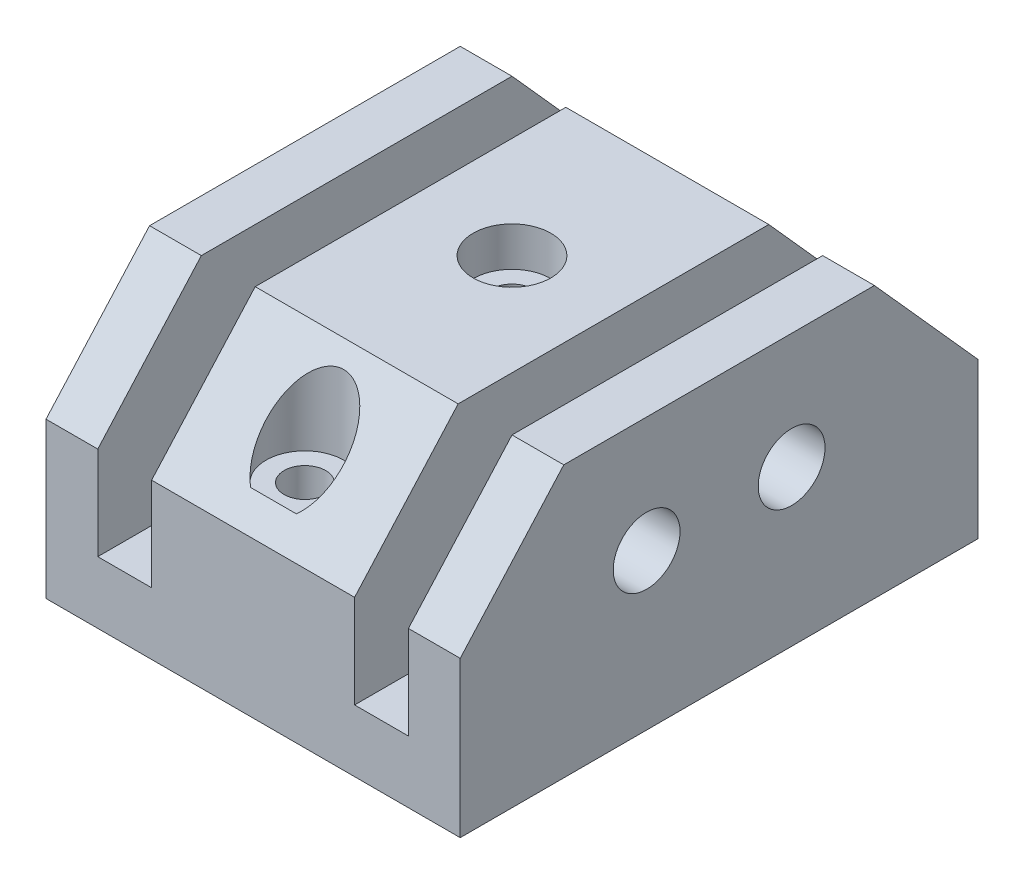
ISO-10303-21;
HEADER;
FILE_DESCRIPTION(('STEP AP214'),'2;1');
FILE_NAME('part.step','',(''),(''),'','','');
FILE_SCHEMA(('AUTOMOTIVE_DESIGN { 1 0 10303 214 1 1 1 1 }'));
ENDSEC;
DATA;
#1=APPLICATION_CONTEXT('core data for automotive mechanical design processes');
#2=APPLICATION_PROTOCOL_DEFINITION('international standard','automotive_design',2000,#1);
#3=PRODUCT_CONTEXT('',#1,'mechanical');
#4=PRODUCT('Part','Part','',(#3));
#5=PRODUCT_RELATED_PRODUCT_CATEGORY('part','',(#4));
#6=PRODUCT_DEFINITION_FORMATION('','',#4);
#7=PRODUCT_DEFINITION_CONTEXT('part definition',#1,'design');
#8=PRODUCT_DEFINITION('design','',#6,#7);
#9=PRODUCT_DEFINITION_SHAPE('','',#8);
#10=(LENGTH_UNIT() NAMED_UNIT(*) SI_UNIT(.MILLI.,.METRE.));
#11=(NAMED_UNIT(*) PLANE_ANGLE_UNIT() SI_UNIT($,.RADIAN.));
#12=(NAMED_UNIT(*) SI_UNIT($,.STERADIAN.) SOLID_ANGLE_UNIT());
#13=UNCERTAINTY_MEASURE_WITH_UNIT(LENGTH_MEASURE(1.E-05),#10,'distance_accuracy_value','');
#14=(GEOMETRIC_REPRESENTATION_CONTEXT(3) GLOBAL_UNCERTAINTY_ASSIGNED_CONTEXT((#13)) GLOBAL_UNIT_ASSIGNED_CONTEXT((#10,
#11,#12)) REPRESENTATION_CONTEXT('',''));
#15=CARTESIAN_POINT('',(0.,0.,0.));
#16=DIRECTION('',(0.,0.,1.));
#17=DIRECTION('',(1.,0.,0.));
#18=AXIS2_PLACEMENT_3D('',#15,#16,#17);
#19=CARTESIAN_POINT('',(-50.8,19.05,0.));
#20=DIRECTION('',(0.,0.666666666666667,0.74535599249993));
#21=DIRECTION('',(0.,-0.74535599249993,0.666666666666667));
#22=AXIS2_PLACEMENT_3D('',#19,#20,#21);
#23=PLANE('',#22);
#24=DIRECTION('',(0.,-0.74535599249993,0.666666666666667));
#25=VECTOR('',#24,1.);
#26=CARTESIAN_POINT('',(-44.45,19.05,0.));
#27=LINE('',#26,#25);
#28=CARTESIAN_POINT('',(-44.45,33.2490316571237,-12.7));
#29=VERTEX_POINT('',#28);
#30=CARTESIAN_POINT('',(-44.45,19.05,0.));
#31=VERTEX_POINT('',#30);
#32=EDGE_CURVE('E362',#29,#31,#27,.T.);
#33=ORIENTED_EDGE('',*,*,#32,.F.);
#34=DIRECTION('',(1.,0.,0.));
#35=VECTOR('',#34,1.);
#36=CARTESIAN_POINT('',(-50.8,33.2490316571237,-12.7));
#37=LINE('',#36,#35);
#38=CARTESIAN_POINT('',(-50.8,33.2490316571237,-12.7));
#39=VERTEX_POINT('',#38);
#40=EDGE_CURVE('E211',#39,#29,#37,.T.);
#41=ORIENTED_EDGE('',*,*,#40,.F.);
#42=DIRECTION('',(0.,-0.74535599249993,0.666666666666667));
#43=VECTOR('',#42,1.);
#44=CARTESIAN_POINT('',(-50.8,19.05,0.));
#45=LINE('',#44,#43);
#46=CARTESIAN_POINT('',(-50.8,19.05,0.));
#47=VERTEX_POINT('',#46);
#48=EDGE_CURVE('E338',#39,#47,#45,.T.);
#49=ORIENTED_EDGE('',*,*,#48,.T.);
#50=DIRECTION('',(1.,0.,0.));
#51=VECTOR('',#50,1.);
#52=CARTESIAN_POINT('',(-50.8,19.05,0.));
#53=LINE('',#52,#51);
#54=EDGE_CURVE('E206',#47,#31,#53,.T.);
#55=ORIENTED_EDGE('',*,*,#54,.T.);
#56=EDGE_LOOP('',(#33,#41,#49,#55));
#57=FACE_BOUND('',#56,.T.);
#58=ADVANCED_FACE('F34',(#57),#23,.T.);
#59=CARTESIAN_POINT('',(-50.8,33.2490316571237,-12.7));
#60=DIRECTION('',(0.,1.,0.));
#61=DIRECTION('',(0.,0.,1.));
#62=AXIS2_PLACEMENT_3D('',#59,#60,#61);
#63=PLANE('',#62);
#64=DIRECTION('',(0.,0.,-1.));
#65=VECTOR('',#64,1.);
#66=CARTESIAN_POINT('',(-44.45,33.2490316571237,0.));
#67=LINE('',#66,#65);
#68=CARTESIAN_POINT('',(-44.45,33.2490316571237,-50.8));
#69=VERTEX_POINT('',#68);
#70=EDGE_CURVE('E370',#29,#69,#67,.T.);
#71=ORIENTED_EDGE('',*,*,#70,.T.);
#72=DIRECTION('',(1.,0.,0.));
#73=VECTOR('',#72,1.);
#74=CARTESIAN_POINT('',(-50.8,33.2490316571237,-50.8));
#75=LINE('',#74,#73);
#76=CARTESIAN_POINT('',(-50.8,33.2490316571237,-50.8));
#77=VERTEX_POINT('',#76);
#78=EDGE_CURVE('E219',#77,#69,#75,.T.);
#79=ORIENTED_EDGE('',*,*,#78,.F.);
#80=DIRECTION('',(0.,0.,1.));
#81=VECTOR('',#80,1.);
#82=CARTESIAN_POINT('',(-50.8,33.2490316571237,-12.7));
#83=LINE('',#82,#81);
#84=EDGE_CURVE('E333',#77,#39,#83,.T.);
#85=ORIENTED_EDGE('',*,*,#84,.T.);
#86=ORIENTED_EDGE('',*,*,#40,.T.);
#87=EDGE_LOOP('',(#71,#79,#85,#86));
#88=FACE_BOUND('',#87,.T.);
#89=ADVANCED_FACE('F289',(#88),#63,.T.);
#90=CARTESIAN_POINT('',(-50.8,33.2490316571237,-50.8));
#91=DIRECTION('',(0.,0.666666666666666,-0.74535599249993));
#92=DIRECTION('',(0.,0.74535599249993,0.666666666666666));
#93=AXIS2_PLACEMENT_3D('',#90,#91,#92);
#94=PLANE('',#93);
#95=DIRECTION('',(0.,0.74535599249993,0.666666666666666));
#96=VECTOR('',#95,1.);
#97=CARTESIAN_POINT('',(-44.45,33.2490316571237,-50.8));
#98=LINE('',#97,#96);
#99=CARTESIAN_POINT('',(-44.45,19.05,-63.5));
#100=VERTEX_POINT('',#99);
#101=EDGE_CURVE('E194',#100,#69,#98,.T.);
#102=ORIENTED_EDGE('',*,*,#101,.F.);
#103=DIRECTION('',(1.,0.,0.));
#104=VECTOR('',#103,1.);
#105=CARTESIAN_POINT('',(-50.8,19.05,-63.5));
#106=LINE('',#105,#104);
#107=CARTESIAN_POINT('',(-50.8,19.05,-63.5));
#108=VERTEX_POINT('',#107);
#109=EDGE_CURVE('E224',#108,#100,#106,.T.);
#110=ORIENTED_EDGE('',*,*,#109,.F.);
#111=DIRECTION('',(0.,0.74535599249993,0.666666666666666));
#112=VECTOR('',#111,1.);
#113=CARTESIAN_POINT('',(-50.8,33.2490316571237,-50.8));
#114=LINE('',#113,#112);
#115=EDGE_CURVE('E331',#108,#77,#114,.T.);
#116=ORIENTED_EDGE('',*,*,#115,.T.);
#117=ORIENTED_EDGE('',*,*,#78,.T.);
#118=EDGE_LOOP('',(#102,#110,#116,#117));
#119=FACE_BOUND('',#118,.T.);
#120=ADVANCED_FACE('F181',(#119),#94,.T.);
#121=DIRECTION('',(1.,0.,0.));
#122=VECTOR('',#121,1.);
#123=CARTESIAN_POINT('',(-50.8,21.844,-2.49902957165377));
#124=LINE('',#123,#122);
#125=CARTESIAN_POINT('',(-28.2020408651558,21.844,-2.49902957165377));
#126=VERTEX_POINT('',#125);
#127=CARTESIAN_POINT('',(-22.5979591348442,21.844,-2.49902957165377));
#128=VERTEX_POINT('',#127);
#129=EDGE_CURVE('E11',#126,#128,#124,.T.);
#130=ORIENTED_EDGE('',*,*,#129,.F.);
#131=CARTESIAN_POINT('',(-25.4,26.1495158285618,-6.35));
#132=DIRECTION('',(0.,0.666666666666667,0.74535599249993));
#133=DIRECTION('',(0.,0.74535599249993,-0.666666666666667));
#134=AXIS2_PLACEMENT_3D('',#131,#132,#133);
#135=ELLIPSE('',#134,7.14374999999999,4.7625);
#136=EDGE_CURVE('E42',#128,#126,#135,.T.);
#137=ORIENTED_EDGE('',*,*,#136,.F.);
#138=EDGE_LOOP('',(#130,#137));
#139=FACE_BOUND('',#138,.T.);
#140=DIRECTION('',(0.,0.74535599249993,-0.666666666666667));
#141=VECTOR('',#140,1.);
#142=CARTESIAN_POINT('',(-37.846,19.05,0.));
#143=LINE('',#142,#141);
#144=CARTESIAN_POINT('',(-37.846,19.05,0.));
#145=VERTEX_POINT('',#144);
#146=CARTESIAN_POINT('',(-37.846,33.2490316571237,-12.7));
#147=VERTEX_POINT('',#146);
#148=EDGE_CURVE('E186',#145,#147,#143,.T.);
#149=ORIENTED_EDGE('',*,*,#148,.F.);
#150=CARTESIAN_POINT('',(-12.954,19.05,0.));
#151=VERTEX_POINT('',#150);
#152=EDGE_CURVE('E189',#145,#151,#53,.T.);
#153=ORIENTED_EDGE('',*,*,#152,.T.);
#154=DIRECTION('',(0.,-0.74535599249993,0.666666666666667));
#155=VECTOR('',#154,1.);
#156=CARTESIAN_POINT('',(-12.954,19.05,0.));
#157=LINE('',#156,#155);
#158=CARTESIAN_POINT('',(-12.954,33.2490316571237,-12.7));
#159=VERTEX_POINT('',#158);
#160=EDGE_CURVE('E319',#159,#151,#157,.T.);
#161=ORIENTED_EDGE('',*,*,#160,.F.);
#162=EDGE_CURVE('E191',#147,#159,#37,.T.);
#163=ORIENTED_EDGE('',*,*,#162,.F.);
#164=EDGE_LOOP('',(#149,#153,#161,#163));
#165=FACE_BOUND('',#164,.T.);
#166=ADVANCED_FACE('F177',(#139,#165),#23,.T.);
#167=CARTESIAN_POINT('',(-25.4,33.2490316571237,-31.75));
#168=DIRECTION('',(0.,1.,0.));
#169=DIRECTION('',(0.,0.,1.));
#170=AXIS2_PLACEMENT_3D('',#167,#168,#169);
#171=CIRCLE('',#170,4.7625);
#172=CARTESIAN_POINT('',(-25.4,33.2490316571237,-26.9875));
#173=VERTEX_POINT('',#172);
#174=EDGE_CURVE('E424',#173,#173,#171,.T.);
#175=ORIENTED_EDGE('',*,*,#174,.F.);
#176=EDGE_LOOP('',(#175));
#177=FACE_BOUND('',#176,.T.);
#178=DIRECTION('',(0.,0.,-1.));
#179=VECTOR('',#178,1.);
#180=CARTESIAN_POINT('',(-37.846,33.2490316571237,0.));
#181=LINE('',#180,#179);
#182=CARTESIAN_POINT('',(-37.846,33.2490316571237,-50.8));
#183=VERTEX_POINT('',#182);
#184=EDGE_CURVE('E373',#147,#183,#181,.T.);
#185=ORIENTED_EDGE('',*,*,#184,.F.);
#186=ORIENTED_EDGE('',*,*,#162,.T.);
#187=DIRECTION('',(0.,0.,-1.));
#188=VECTOR('',#187,1.);
#189=CARTESIAN_POINT('',(-12.954,33.2490316571237,0.));
#190=LINE('',#189,#188);
#191=CARTESIAN_POINT('',(-12.954,33.2490316571237,-50.8));
#192=VERTEX_POINT('',#191);
#193=EDGE_CURVE('E344',#159,#192,#190,.T.);
#194=ORIENTED_EDGE('',*,*,#193,.T.);
#195=EDGE_CURVE('E222',#183,#192,#75,.T.);
#196=ORIENTED_EDGE('',*,*,#195,.F.);
#197=EDGE_LOOP('',(#185,#186,#194,#196));
#198=FACE_BOUND('',#197,.T.);
#199=ADVANCED_FACE('F180',(#177,#198),#63,.T.);
#200=DIRECTION('',(-1.,0.,0.));
#201=VECTOR('',#200,1.);
#202=CARTESIAN_POINT('',(-50.8,21.844,-61.0009704283462));
#203=LINE('',#202,#201);
#204=CARTESIAN_POINT('',(-22.5979591348442,21.844,-61.0009704283462));
#205=VERTEX_POINT('',#204);
#206=CARTESIAN_POINT('',(-28.2020408651557,21.844,-61.0009704283462));
#207=VERTEX_POINT('',#206);
#208=EDGE_CURVE('E171',#205,#207,#203,.T.);
#209=ORIENTED_EDGE('',*,*,#208,.F.);
#210=CARTESIAN_POINT('',(-25.4,26.1495158285618,-57.15));
#211=DIRECTION('',(0.,0.666666666666666,-0.74535599249993));
#212=DIRECTION('',(0.,0.74535599249993,0.666666666666666));
#213=AXIS2_PLACEMENT_3D('',#210,#211,#212);
#214=ELLIPSE('',#213,7.14375,4.7625);
#215=EDGE_CURVE('E256',#207,#205,#214,.T.);
#216=ORIENTED_EDGE('',*,*,#215,.F.);
#217=EDGE_LOOP('',(#209,#216));
#218=FACE_BOUND('',#217,.T.);
#219=DIRECTION('',(0.,-0.74535599249993,-0.666666666666666));
#220=VECTOR('',#219,1.);
#221=CARTESIAN_POINT('',(-37.846,33.2490316571237,-50.8));
#222=LINE('',#221,#220);
#223=CARTESIAN_POINT('',(-37.846,19.05,-63.5));
#224=VERTEX_POINT('',#223);
#225=EDGE_CURVE('E195',#183,#224,#222,.T.);
#226=ORIENTED_EDGE('',*,*,#225,.F.);
#227=ORIENTED_EDGE('',*,*,#195,.T.);
#228=DIRECTION('',(0.,0.74535599249993,0.666666666666666));
#229=VECTOR('',#228,1.);
#230=CARTESIAN_POINT('',(-12.954,33.2490316571237,-50.8));
#231=LINE('',#230,#229);
#232=CARTESIAN_POINT('',(-12.954,19.05,-63.5));
#233=VERTEX_POINT('',#232);
#234=EDGE_CURVE('E251',#233,#192,#231,.T.);
#235=ORIENTED_EDGE('',*,*,#234,.F.);
#236=EDGE_CURVE('E227',#224,#233,#106,.T.);
#237=ORIENTED_EDGE('',*,*,#236,.F.);
#238=EDGE_LOOP('',(#226,#227,#235,#237));
#239=FACE_BOUND('',#238,.T.);
#240=ADVANCED_FACE('F274',(#218,#239),#94,.T.);
#241=CARTESIAN_POINT('',(-50.8,0.,0.));
#242=DIRECTION('',(0.,0.,1.));
#243=DIRECTION('',(1.,0.,0.));
#244=AXIS2_PLACEMENT_3D('',#241,#242,#243);
#245=PLANE('',#244);
#246=DIRECTION('',(0.,1.,0.));
#247=VECTOR('',#246,1.);
#248=CARTESIAN_POINT('',(-44.45,7.62,0.));
#249=LINE('',#248,#247);
#250=CARTESIAN_POINT('',(-44.45,7.62,0.));
#251=VERTEX_POINT('',#250);
#252=EDGE_CURVE('E383',#251,#31,#249,.T.);
#253=ORIENTED_EDGE('',*,*,#252,.T.);
#254=ORIENTED_EDGE('',*,*,#54,.F.);
#255=DIRECTION('',(0.,-1.,0.));
#256=VECTOR('',#255,1.);
#257=CARTESIAN_POINT('',(-50.8,0.,0.));
#258=LINE('',#257,#256);
#259=CARTESIAN_POINT('',(-50.8,0.,0.));
#260=VERTEX_POINT('',#259);
#261=EDGE_CURVE('E229',#47,#260,#258,.T.);
#262=ORIENTED_EDGE('',*,*,#261,.T.);
#263=DIRECTION('',(1.,0.,0.));
#264=VECTOR('',#263,1.);
#265=CARTESIAN_POINT('',(-50.8,0.,0.));
#266=LINE('',#265,#264);
#267=CARTESIAN_POINT('',(0.,0.,0.));
#268=VERTEX_POINT('',#267);
#269=EDGE_CURVE('E238',#260,#268,#266,.T.);
#270=ORIENTED_EDGE('',*,*,#269,.T.);
#271=DIRECTION('',(0.,-1.,0.));
#272=VECTOR('',#271,1.);
#273=CARTESIAN_POINT('',(0.,0.,0.));
#274=LINE('',#273,#272);
#275=CARTESIAN_POINT('',(0.,19.05,0.));
#276=VERTEX_POINT('',#275);
#277=EDGE_CURVE('E210',#276,#268,#274,.T.);
#278=ORIENTED_EDGE('',*,*,#277,.F.);
#279=CARTESIAN_POINT('',(-6.35,19.05,0.));
#280=VERTEX_POINT('',#279);
#281=EDGE_CURVE('E207',#280,#276,#53,.T.);
#282=ORIENTED_EDGE('',*,*,#281,.F.);
#283=DIRECTION('',(0.,-1.,0.));
#284=VECTOR('',#283,1.);
#285=CARTESIAN_POINT('',(-6.35,7.62,0.));
#286=LINE('',#285,#284);
#287=CARTESIAN_POINT('',(-6.35,7.62,0.));
#288=VERTEX_POINT('',#287);
#289=EDGE_CURVE('E323',#280,#288,#286,.T.);
#290=ORIENTED_EDGE('',*,*,#289,.T.);
#291=DIRECTION('',(-1.,0.,0.));
#292=VECTOR('',#291,1.);
#293=CARTESIAN_POINT('',(-6.35,7.62,0.));
#294=LINE('',#293,#292);
#295=CARTESIAN_POINT('',(-12.954,7.62,0.));
#296=VERTEX_POINT('',#295);
#297=EDGE_CURVE('E348',#288,#296,#294,.T.);
#298=ORIENTED_EDGE('',*,*,#297,.T.);
#299=DIRECTION('',(0.,1.,0.));
#300=VECTOR('',#299,1.);
#301=CARTESIAN_POINT('',(-12.954,7.62,0.));
#302=LINE('',#301,#300);
#303=EDGE_CURVE('E205',#296,#151,#302,.T.);
#304=ORIENTED_EDGE('',*,*,#303,.T.);
#305=ORIENTED_EDGE('',*,*,#152,.F.);
#306=DIRECTION('',(0.,-1.,0.));
#307=VECTOR('',#306,1.);
#308=CARTESIAN_POINT('',(-37.846,7.62,0.));
#309=LINE('',#308,#307);
#310=CARTESIAN_POINT('',(-37.846,7.62,0.));
#311=VERTEX_POINT('',#310);
#312=EDGE_CURVE('E202',#145,#311,#309,.T.);
#313=ORIENTED_EDGE('',*,*,#312,.T.);
#314=DIRECTION('',(-1.,0.,0.));
#315=VECTOR('',#314,1.);
#316=CARTESIAN_POINT('',(-37.846,7.62,0.));
#317=LINE('',#316,#315);
#318=EDGE_CURVE('E374',#311,#251,#317,.T.);
#319=ORIENTED_EDGE('',*,*,#318,.T.);
#320=EDGE_LOOP('',(#253,#254,#262,#270,#278,#282,#290,#298,#304,#305,#313,#319));
#321=FACE_BOUND('',#320,.T.);
#322=ADVANCED_FACE('F36',(#321),#245,.T.);
#323=CARTESIAN_POINT('',(-50.8,0.,-63.5));
#324=DIRECTION('',(0.,0.,-1.));
#325=DIRECTION('',(-1.,0.,0.));
#326=AXIS2_PLACEMENT_3D('',#323,#324,#325);
#327=PLANE('',#326);
#328=DIRECTION('',(0.,1.,0.));
#329=VECTOR('',#328,1.);
#330=CARTESIAN_POINT('',(-44.45,7.62,-63.5));
#331=LINE('',#330,#329);
#332=CARTESIAN_POINT('',(-44.45,7.62,-63.5));
#333=VERTEX_POINT('',#332);
#334=EDGE_CURVE('E384',#333,#100,#331,.T.);
#335=ORIENTED_EDGE('',*,*,#334,.F.);
#336=DIRECTION('',(-1.,0.,0.));
#337=VECTOR('',#336,1.);
#338=CARTESIAN_POINT('',(-37.846,7.62,-63.5));
#339=LINE('',#338,#337);
#340=CARTESIAN_POINT('',(-37.846,7.62,-63.5));
#341=VERTEX_POINT('',#340);
#342=EDGE_CURVE('E380',#341,#333,#339,.T.);
#343=ORIENTED_EDGE('',*,*,#342,.F.);
#344=DIRECTION('',(0.,-1.,0.));
#345=VECTOR('',#344,1.);
#346=CARTESIAN_POINT('',(-37.846,0.,-63.5));
#347=LINE('',#346,#345);
#348=EDGE_CURVE('E254',#224,#341,#347,.T.);
#349=ORIENTED_EDGE('',*,*,#348,.F.);
#350=ORIENTED_EDGE('',*,*,#236,.T.);
#351=DIRECTION('',(0.,1.,0.));
#352=VECTOR('',#351,1.);
#353=CARTESIAN_POINT('',(-12.954,7.62,-63.5));
#354=LINE('',#353,#352);
#355=CARTESIAN_POINT('',(-12.954,7.62,-63.5));
#356=VERTEX_POINT('',#355);
#357=EDGE_CURVE('E359',#356,#233,#354,.T.);
#358=ORIENTED_EDGE('',*,*,#357,.F.);
#359=DIRECTION('',(-1.,0.,0.));
#360=VECTOR('',#359,1.);
#361=CARTESIAN_POINT('',(-6.35,7.62,-63.5));
#362=LINE('',#361,#360);
#363=CARTESIAN_POINT('',(-6.35,7.62,-63.5));
#364=VERTEX_POINT('',#363);
#365=EDGE_CURVE('E354',#364,#356,#362,.T.);
#366=ORIENTED_EDGE('',*,*,#365,.F.);
#367=DIRECTION('',(0.,-1.,0.));
#368=VECTOR('',#367,1.);
#369=CARTESIAN_POINT('',(-6.35,7.62,-63.5));
#370=LINE('',#369,#368);
#371=CARTESIAN_POINT('',(-6.35,19.05,-63.5));
#372=VERTEX_POINT('',#371);
#373=EDGE_CURVE('E357',#372,#364,#370,.T.);
#374=ORIENTED_EDGE('',*,*,#373,.F.);
#375=CARTESIAN_POINT('',(0.,19.05,-63.5));
#376=VERTEX_POINT('',#375);
#377=EDGE_CURVE('E228',#372,#376,#106,.T.);
#378=ORIENTED_EDGE('',*,*,#377,.T.);
#379=DIRECTION('',(0.,1.,0.));
#380=VECTOR('',#379,1.);
#381=CARTESIAN_POINT('',(0.,0.,-63.5));
#382=LINE('',#381,#380);
#383=CARTESIAN_POINT('',(0.,0.,-63.5));
#384=VERTEX_POINT('',#383);
#385=EDGE_CURVE('E233',#384,#376,#382,.T.);
#386=ORIENTED_EDGE('',*,*,#385,.F.);
#387=DIRECTION('',(1.,0.,0.));
#388=VECTOR('',#387,1.);
#389=CARTESIAN_POINT('',(-50.8,0.,-63.5));
#390=LINE('',#389,#388);
#391=CARTESIAN_POINT('',(-50.8,0.,-63.5));
#392=VERTEX_POINT('',#391);
#393=EDGE_CURVE('E246',#392,#384,#390,.T.);
#394=ORIENTED_EDGE('',*,*,#393,.F.);
#395=DIRECTION('',(0.,1.,0.));
#396=VECTOR('',#395,1.);
#397=CARTESIAN_POINT('',(-50.8,0.,-63.5));
#398=LINE('',#397,#396);
#399=EDGE_CURVE('E236',#392,#108,#398,.T.);
#400=ORIENTED_EDGE('',*,*,#399,.T.);
#401=ORIENTED_EDGE('',*,*,#109,.T.);
#402=EDGE_LOOP('',(#335,#343,#349,#350,#358,#366,#374,#378,#386,#394,#400,#401));
#403=FACE_BOUND('',#402,.T.);
#404=ADVANCED_FACE('F490',(#403),#327,.T.);
#405=CARTESIAN_POINT('',(-50.8,0.,0.));
#406=DIRECTION('',(0.,-1.,0.));
#407=DIRECTION('',(0.,0.,-1.));
#408=AXIS2_PLACEMENT_3D('',#405,#406,#407);
#409=PLANE('',#408);
#410=CARTESIAN_POINT('',(-25.4,0.,-6.35));
#411=DIRECTION('',(0.,-1.,0.));
#412=DIRECTION('',(0.,0.,-1.));
#413=AXIS2_PLACEMENT_3D('',#410,#411,#412);
#414=CIRCLE('',#413,2.5527);
#415=CARTESIAN_POINT('',(-25.4,0.,-8.9027));
#416=VERTEX_POINT('',#415);
#417=EDGE_CURVE('E434',#416,#416,#414,.T.);
#418=ORIENTED_EDGE('',*,*,#417,.F.);
#419=EDGE_LOOP('',(#418));
#420=FACE_BOUND('',#419,.T.);
#421=CARTESIAN_POINT('',(-25.4,0.,-57.15));
#422=DIRECTION('',(0.,-1.,0.));
#423=DIRECTION('',(0.,0.,-1.));
#424=AXIS2_PLACEMENT_3D('',#421,#422,#423);
#425=CIRCLE('',#424,2.5527);
#426=CARTESIAN_POINT('',(-25.4,0.,-59.7027));
#427=VERTEX_POINT('',#426);
#428=EDGE_CURVE('E427',#427,#427,#425,.T.);
#429=ORIENTED_EDGE('',*,*,#428,.F.);
#430=EDGE_LOOP('',(#429));
#431=FACE_BOUND('',#430,.T.);
#432=CARTESIAN_POINT('',(-25.4,0.,-31.75));
#433=DIRECTION('',(0.,-1.,0.));
#434=DIRECTION('',(0.,0.,-1.));
#435=AXIS2_PLACEMENT_3D('',#432,#433,#434);
#436=CIRCLE('',#435,2.5527);
#437=CARTESIAN_POINT('',(-25.4,0.,-34.3027));
#438=VERTEX_POINT('',#437);
#439=EDGE_CURVE('E408',#438,#438,#436,.T.);
#440=ORIENTED_EDGE('',*,*,#439,.F.);
#441=EDGE_LOOP('',(#440));
#442=FACE_BOUND('',#441,.T.);
#443=DIRECTION('',(0.,0.,-1.));
#444=VECTOR('',#443,1.);
#445=CARTESIAN_POINT('',(0.,0.,0.));
#446=LINE('',#445,#444);
#447=EDGE_CURVE('E241',#268,#384,#446,.T.);
#448=ORIENTED_EDGE('',*,*,#447,.F.);
#449=ORIENTED_EDGE('',*,*,#269,.F.);
#450=DIRECTION('',(0.,0.,-1.));
#451=VECTOR('',#450,1.);
#452=CARTESIAN_POINT('',(-50.8,0.,0.));
#453=LINE('',#452,#451);
#454=EDGE_CURVE('E232',#260,#392,#453,.T.);
#455=ORIENTED_EDGE('',*,*,#454,.T.);
#456=ORIENTED_EDGE('',*,*,#393,.T.);
#457=EDGE_LOOP('',(#448,#449,#455,#456));
#458=FACE_BOUND('',#457,.T.);
#459=ADVANCED_FACE('F485',(#420,#431,#442,#458),#409,.T.);
#460=CARTESIAN_POINT('',(-50.8,0.,0.));
#461=DIRECTION('',(-1.,0.,0.));
#462=DIRECTION('',(0.,0.,1.));
#463=AXIS2_PLACEMENT_3D('',#460,#461,#462);
#464=PLANE('',#463);
#465=CARTESIAN_POINT('',(-50.8,19.05,-22.86));
#466=DIRECTION('',(1.,0.,0.));
#467=DIRECTION('',(0.,0.,-1.));
#468=AXIS2_PLACEMENT_3D('',#465,#466,#467);
#469=CIRCLE('',#468,4.09575);
#470=CARTESIAN_POINT('',(-50.8,19.05,-26.95575));
#471=VERTEX_POINT('',#470);
#472=EDGE_CURVE('E261',#471,#471,#469,.T.);
#473=ORIENTED_EDGE('',*,*,#472,.T.);
#474=EDGE_LOOP('',(#473));
#475=FACE_BOUND('',#474,.T.);
#476=CARTESIAN_POINT('',(-50.8,19.05,-40.64));
#477=DIRECTION('',(1.,0.,0.));
#478=DIRECTION('',(0.,0.,-1.));
#479=AXIS2_PLACEMENT_3D('',#476,#477,#478);
#480=CIRCLE('',#479,4.09575000000001);
#481=CARTESIAN_POINT('',(-50.8,19.05,-44.73575));
#482=VERTEX_POINT('',#481);
#483=EDGE_CURVE('E407',#482,#482,#480,.T.);
#484=ORIENTED_EDGE('',*,*,#483,.T.);
#485=EDGE_LOOP('',(#484));
#486=FACE_BOUND('',#485,.T.);
#487=ORIENTED_EDGE('',*,*,#261,.F.);
#488=ORIENTED_EDGE('',*,*,#48,.F.);
#489=ORIENTED_EDGE('',*,*,#84,.F.);
#490=ORIENTED_EDGE('',*,*,#115,.F.);
#491=ORIENTED_EDGE('',*,*,#399,.F.);
#492=ORIENTED_EDGE('',*,*,#454,.F.);
#493=EDGE_LOOP('',(#487,#488,#489,#490,#491,#492));
#494=FACE_BOUND('',#493,.T.);
#495=ADVANCED_FACE('F308',(#475,#486,#494),#464,.T.);
#496=CARTESIAN_POINT('',(0.,0.,0.));
#497=DIRECTION('',(-1.,0.,0.));
#498=DIRECTION('',(0.,0.,1.));
#499=AXIS2_PLACEMENT_3D('',#496,#497,#498);
#500=PLANE('',#499);
#501=CARTESIAN_POINT('',(0.,19.05,-22.86));
#502=DIRECTION('',(1.,0.,0.));
#503=DIRECTION('',(0.,0.,-1.));
#504=AXIS2_PLACEMENT_3D('',#501,#502,#503);
#505=CIRCLE('',#504,4.09575);
#506=CARTESIAN_POINT('',(0.,19.05,-26.95575));
#507=VERTEX_POINT('',#506);
#508=EDGE_CURVE('E411',#507,#507,#505,.T.);
#509=ORIENTED_EDGE('',*,*,#508,.F.);
#510=EDGE_LOOP('',(#509));
#511=FACE_BOUND('',#510,.T.);
#512=CARTESIAN_POINT('',(0.,19.05,-40.64));
#513=DIRECTION('',(1.,0.,0.));
#514=DIRECTION('',(0.,0.,-1.));
#515=AXIS2_PLACEMENT_3D('',#512,#513,#514);
#516=CIRCLE('',#515,4.09575000000001);
#517=CARTESIAN_POINT('',(0.,19.05,-44.73575));
#518=VERTEX_POINT('',#517);
#519=EDGE_CURVE('E404',#518,#518,#516,.T.);
#520=ORIENTED_EDGE('',*,*,#519,.F.);
#521=EDGE_LOOP('',(#520));
#522=FACE_BOUND('',#521,.T.);
#523=ORIENTED_EDGE('',*,*,#277,.T.);
#524=ORIENTED_EDGE('',*,*,#447,.T.);
#525=ORIENTED_EDGE('',*,*,#385,.T.);
#526=DIRECTION('',(0.,0.74535599249993,0.666666666666666));
#527=VECTOR('',#526,1.);
#528=CARTESIAN_POINT('',(0.,33.2490316571237,-50.8));
#529=LINE('',#528,#527);
#530=CARTESIAN_POINT('',(0.,33.2490316571237,-50.8));
#531=VERTEX_POINT('',#530);
#532=EDGE_CURVE('E335',#376,#531,#529,.T.);
#533=ORIENTED_EDGE('',*,*,#532,.T.);
#534=DIRECTION('',(0.,0.,1.));
#535=VECTOR('',#534,1.);
#536=CARTESIAN_POINT('',(0.,33.2490316571237,-12.7));
#537=LINE('',#536,#535);
#538=CARTESIAN_POINT('',(0.,33.2490316571237,-12.7));
#539=VERTEX_POINT('',#538);
#540=EDGE_CURVE('E330',#531,#539,#537,.T.);
#541=ORIENTED_EDGE('',*,*,#540,.T.);
#542=DIRECTION('',(0.,-0.74535599249993,0.666666666666667));
#543=VECTOR('',#542,1.);
#544=CARTESIAN_POINT('',(0.,19.05,0.));
#545=LINE('',#544,#543);
#546=EDGE_CURVE('E214',#539,#276,#545,.T.);
#547=ORIENTED_EDGE('',*,*,#546,.T.);
#548=EDGE_LOOP('',(#523,#524,#525,#533,#541,#547));
#549=FACE_BOUND('',#548,.T.);
#550=ADVANCED_FACE('F300',(#511,#522,#549),#500,.F.);
#551=DIRECTION('',(0.,0.74535599249993,-0.666666666666667));
#552=VECTOR('',#551,1.);
#553=CARTESIAN_POINT('',(-6.35,19.05,0.));
#554=LINE('',#553,#552);
#555=CARTESIAN_POINT('',(-6.35,33.2490316571237,-12.7));
#556=VERTEX_POINT('',#555);
#557=EDGE_CURVE('E313',#280,#556,#554,.T.);
#558=ORIENTED_EDGE('',*,*,#557,.F.);
#559=ORIENTED_EDGE('',*,*,#281,.T.);
#560=ORIENTED_EDGE('',*,*,#546,.F.);
#561=EDGE_CURVE('E218',#556,#539,#37,.T.);
#562=ORIENTED_EDGE('',*,*,#561,.F.);
#563=EDGE_LOOP('',(#558,#559,#560,#562));
#564=FACE_BOUND('',#563,.T.);
#565=ADVANCED_FACE('F183',(#564),#23,.T.);
#566=DIRECTION('',(0.,0.,-1.));
#567=VECTOR('',#566,1.);
#568=CARTESIAN_POINT('',(-6.35,33.2490316571237,0.));
#569=LINE('',#568,#567);
#570=CARTESIAN_POINT('',(-6.35,33.2490316571237,-50.8));
#571=VERTEX_POINT('',#570);
#572=EDGE_CURVE('E347',#556,#571,#569,.T.);
#573=ORIENTED_EDGE('',*,*,#572,.F.);
#574=ORIENTED_EDGE('',*,*,#561,.T.);
#575=ORIENTED_EDGE('',*,*,#540,.F.);
#576=EDGE_CURVE('E223',#571,#531,#75,.T.);
#577=ORIENTED_EDGE('',*,*,#576,.F.);
#578=EDGE_LOOP('',(#573,#574,#575,#577));
#579=FACE_BOUND('',#578,.T.);
#580=ADVANCED_FACE('F296',(#579),#63,.T.);
#581=DIRECTION('',(0.,-0.74535599249993,-0.666666666666666));
#582=VECTOR('',#581,1.);
#583=CARTESIAN_POINT('',(-6.35,33.2490316571237,-50.8));
#584=LINE('',#583,#582);
#585=EDGE_CURVE('E248',#571,#372,#584,.T.);
#586=ORIENTED_EDGE('',*,*,#585,.F.);
#587=ORIENTED_EDGE('',*,*,#576,.T.);
#588=ORIENTED_EDGE('',*,*,#532,.F.);
#589=ORIENTED_EDGE('',*,*,#377,.F.);
#590=EDGE_LOOP('',(#586,#587,#588,#589));
#591=FACE_BOUND('',#590,.T.);
#592=ADVANCED_FACE('F306',(#591),#94,.T.);
#593=CARTESIAN_POINT('',(-12.954,7.62,0.));
#594=DIRECTION('',(-1.,0.,0.));
#595=DIRECTION('',(0.,-1.,0.));
#596=AXIS2_PLACEMENT_3D('',#593,#594,#595);
#597=PLANE('',#596);
#598=CARTESIAN_POINT('',(-12.954,19.05,-22.86));
#599=DIRECTION('',(-1.,0.,0.));
#600=DIRECTION('',(0.,-1.,0.));
#601=AXIS2_PLACEMENT_3D('',#598,#599,#600);
#602=CIRCLE('',#601,4.09575);
#603=CARTESIAN_POINT('',(-12.954,14.95425,-22.86));
#604=VERTEX_POINT('',#603);
#605=EDGE_CURVE('E386',#604,#604,#602,.T.);
#606=ORIENTED_EDGE('',*,*,#605,.T.);
#607=EDGE_LOOP('',(#606));
#608=FACE_BOUND('',#607,.T.);
#609=CARTESIAN_POINT('',(-12.954,19.05,-40.64));
#610=DIRECTION('',(-1.,0.,0.));
#611=DIRECTION('',(0.,-1.,0.));
#612=AXIS2_PLACEMENT_3D('',#609,#610,#611);
#613=CIRCLE('',#612,4.09575000000001);
#614=CARTESIAN_POINT('',(-12.954,14.95425,-40.64));
#615=VERTEX_POINT('',#614);
#616=EDGE_CURVE('E266',#615,#615,#613,.T.);
#617=ORIENTED_EDGE('',*,*,#616,.T.);
#618=EDGE_LOOP('',(#617));
#619=FACE_BOUND('',#618,.T.);
#620=ORIENTED_EDGE('',*,*,#160,.T.);
#621=ORIENTED_EDGE('',*,*,#303,.F.);
#622=DIRECTION('',(0.,0.,-1.));
#623=VECTOR('',#622,1.);
#624=CARTESIAN_POINT('',(-12.954,7.62,0.));
#625=LINE('',#624,#623);
#626=EDGE_CURVE('E320',#296,#356,#625,.T.);
#627=ORIENTED_EDGE('',*,*,#626,.T.);
#628=ORIENTED_EDGE('',*,*,#357,.T.);
#629=ORIENTED_EDGE('',*,*,#234,.T.);
#630=ORIENTED_EDGE('',*,*,#193,.F.);
#631=EDGE_LOOP('',(#620,#621,#627,#628,#629,#630));
#632=FACE_BOUND('',#631,.T.);
#633=ADVANCED_FACE('F646',(#608,#619,#632),#597,.F.);
#634=CARTESIAN_POINT('',(-6.35,7.62,0.));
#635=DIRECTION('',(0.,-1.,0.));
#636=DIRECTION('',(0.,0.,-1.));
#637=AXIS2_PLACEMENT_3D('',#634,#635,#636);
#638=PLANE('',#637);
#639=ORIENTED_EDGE('',*,*,#365,.T.);
#640=ORIENTED_EDGE('',*,*,#626,.F.);
#641=ORIENTED_EDGE('',*,*,#297,.F.);
#642=DIRECTION('',(0.,0.,-1.));
#643=VECTOR('',#642,1.);
#644=CARTESIAN_POINT('',(-6.35,7.62,0.));
#645=LINE('',#644,#643);
#646=EDGE_CURVE('E350',#288,#364,#645,.T.);
#647=ORIENTED_EDGE('',*,*,#646,.T.);
#648=EDGE_LOOP('',(#639,#640,#641,#647));
#649=FACE_BOUND('',#648,.T.);
#650=ADVANCED_FACE('F637',(#649),#638,.F.);
#651=CARTESIAN_POINT('',(-6.35,7.62,0.));
#652=DIRECTION('',(1.,0.,0.));
#653=DIRECTION('',(0.,0.,-1.));
#654=AXIS2_PLACEMENT_3D('',#651,#652,#653);
#655=PLANE('',#654);
#656=CARTESIAN_POINT('',(-6.35,19.05,-22.86));
#657=DIRECTION('',(1.,0.,0.));
#658=DIRECTION('',(0.,0.,-1.));
#659=AXIS2_PLACEMENT_3D('',#656,#657,#658);
#660=CIRCLE('',#659,4.09575);
#661=CARTESIAN_POINT('',(-6.35,19.05,-26.95575));
#662=VERTEX_POINT('',#661);
#663=EDGE_CURVE('E392',#662,#662,#660,.T.);
#664=ORIENTED_EDGE('',*,*,#663,.T.);
#665=EDGE_LOOP('',(#664));
#666=FACE_BOUND('',#665,.T.);
#667=CARTESIAN_POINT('',(-6.35,19.05,-40.64));
#668=DIRECTION('',(1.,0.,0.));
#669=DIRECTION('',(0.,0.,-1.));
#670=AXIS2_PLACEMENT_3D('',#667,#668,#669);
#671=CIRCLE('',#670,4.09575000000001);
#672=CARTESIAN_POINT('',(-6.35,19.05,-44.73575));
#673=VERTEX_POINT('',#672);
#674=EDGE_CURVE('E399',#673,#673,#671,.T.);
#675=ORIENTED_EDGE('',*,*,#674,.T.);
#676=EDGE_LOOP('',(#675));
#677=FACE_BOUND('',#676,.T.);
#678=ORIENTED_EDGE('',*,*,#557,.T.);
#679=ORIENTED_EDGE('',*,*,#572,.T.);
#680=ORIENTED_EDGE('',*,*,#585,.T.);
#681=ORIENTED_EDGE('',*,*,#373,.T.);
#682=ORIENTED_EDGE('',*,*,#646,.F.);
#683=ORIENTED_EDGE('',*,*,#289,.F.);
#684=EDGE_LOOP('',(#678,#679,#680,#681,#682,#683));
#685=FACE_BOUND('',#684,.T.);
#686=ADVANCED_FACE('F626',(#666,#677,#685),#655,.F.);
#687=CARTESIAN_POINT('',(-44.45,7.62,0.));
#688=DIRECTION('',(-1.,0.,0.));
#689=DIRECTION('',(0.,-1.,0.));
#690=AXIS2_PLACEMENT_3D('',#687,#688,#689);
#691=PLANE('',#690);
#692=CARTESIAN_POINT('',(-44.45,19.05,-22.86));
#693=DIRECTION('',(-1.,0.,0.));
#694=DIRECTION('',(0.,-1.,0.));
#695=AXIS2_PLACEMENT_3D('',#692,#693,#694);
#696=CIRCLE('',#695,4.09575);
#697=CARTESIAN_POINT('',(-44.45,14.95425,-22.86));
#698=VERTEX_POINT('',#697);
#699=EDGE_CURVE('E265',#698,#698,#696,.T.);
#700=ORIENTED_EDGE('',*,*,#699,.T.);
#701=EDGE_LOOP('',(#700));
#702=FACE_BOUND('',#701,.T.);
#703=CARTESIAN_POINT('',(-44.45,19.05,-40.64));
#704=DIRECTION('',(-1.,0.,0.));
#705=DIRECTION('',(0.,-1.,0.));
#706=AXIS2_PLACEMENT_3D('',#703,#704,#705);
#707=CIRCLE('',#706,4.09575000000001);
#708=CARTESIAN_POINT('',(-44.45,14.95425,-40.64));
#709=VERTEX_POINT('',#708);
#710=EDGE_CURVE('E260',#709,#709,#707,.T.);
#711=ORIENTED_EDGE('',*,*,#710,.T.);
#712=EDGE_LOOP('',(#711));
#713=FACE_BOUND('',#712,.T.);
#714=ORIENTED_EDGE('',*,*,#32,.T.);
#715=ORIENTED_EDGE('',*,*,#252,.F.);
#716=DIRECTION('',(0.,0.,-1.));
#717=VECTOR('',#716,1.);
#718=CARTESIAN_POINT('',(-44.45,7.62,0.));
#719=LINE('',#718,#717);
#720=EDGE_CURVE('E369',#251,#333,#719,.T.);
#721=ORIENTED_EDGE('',*,*,#720,.T.);
#722=ORIENTED_EDGE('',*,*,#334,.T.);
#723=ORIENTED_EDGE('',*,*,#101,.T.);
#724=ORIENTED_EDGE('',*,*,#70,.F.);
#725=EDGE_LOOP('',(#714,#715,#721,#722,#723,#724));
#726=FACE_BOUND('',#725,.T.);
#727=ADVANCED_FACE('F621',(#702,#713,#726),#691,.F.);
#728=CARTESIAN_POINT('',(-37.846,7.62,0.));
#729=DIRECTION('',(0.,-1.,0.));
#730=DIRECTION('',(0.,0.,-1.));
#731=AXIS2_PLACEMENT_3D('',#728,#729,#730);
#732=PLANE('',#731);
#733=ORIENTED_EDGE('',*,*,#342,.T.);
#734=ORIENTED_EDGE('',*,*,#720,.F.);
#735=ORIENTED_EDGE('',*,*,#318,.F.);
#736=DIRECTION('',(0.,0.,-1.));
#737=VECTOR('',#736,1.);
#738=CARTESIAN_POINT('',(-37.846,7.62,0.));
#739=LINE('',#738,#737);
#740=EDGE_CURVE('E376',#311,#341,#739,.T.);
#741=ORIENTED_EDGE('',*,*,#740,.T.);
#742=EDGE_LOOP('',(#733,#734,#735,#741));
#743=FACE_BOUND('',#742,.T.);
#744=ADVANCED_FACE('F613',(#743),#732,.F.);
#745=CARTESIAN_POINT('',(-37.846,7.62,0.));
#746=DIRECTION('',(1.,0.,0.));
#747=DIRECTION('',(0.,0.,-1.));
#748=AXIS2_PLACEMENT_3D('',#745,#746,#747);
#749=PLANE('',#748);
#750=CARTESIAN_POINT('',(-37.846,19.05,-22.86));
#751=DIRECTION('',(1.,0.,0.));
#752=DIRECTION('',(0.,0.,-1.));
#753=AXIS2_PLACEMENT_3D('',#750,#751,#752);
#754=CIRCLE('',#753,4.09575);
#755=CARTESIAN_POINT('',(-37.846,19.05,-26.95575));
#756=VERTEX_POINT('',#755);
#757=EDGE_CURVE('E262',#756,#756,#754,.T.);
#758=ORIENTED_EDGE('',*,*,#757,.T.);
#759=EDGE_LOOP('',(#758));
#760=FACE_BOUND('',#759,.T.);
#761=CARTESIAN_POINT('',(-37.846,19.05,-40.64));
#762=DIRECTION('',(1.,0.,0.));
#763=DIRECTION('',(0.,0.,-1.));
#764=AXIS2_PLACEMENT_3D('',#761,#762,#763);
#765=CIRCLE('',#764,4.09575000000001);
#766=CARTESIAN_POINT('',(-37.846,19.05,-44.73575));
#767=VERTEX_POINT('',#766);
#768=EDGE_CURVE('E257',#767,#767,#765,.T.);
#769=ORIENTED_EDGE('',*,*,#768,.T.);
#770=EDGE_LOOP('',(#769));
#771=FACE_BOUND('',#770,.T.);
#772=ORIENTED_EDGE('',*,*,#148,.T.);
#773=ORIENTED_EDGE('',*,*,#184,.T.);
#774=ORIENTED_EDGE('',*,*,#225,.T.);
#775=ORIENTED_EDGE('',*,*,#348,.T.);
#776=ORIENTED_EDGE('',*,*,#740,.F.);
#777=ORIENTED_EDGE('',*,*,#312,.F.);
#778=EDGE_LOOP('',(#772,#773,#774,#775,#776,#777));
#779=FACE_BOUND('',#778,.T.);
#780=ADVANCED_FACE('F604',(#760,#771,#779),#749,.F.);
#781=CARTESIAN_POINT('',(-50.8,19.05,-40.64));
#782=DIRECTION('',(1.,0.,0.));
#783=DIRECTION('',(0.,0.,-1.));
#784=AXIS2_PLACEMENT_3D('',#781,#782,#783);
#785=CYLINDRICAL_SURFACE('',#784,4.09575000000001);
#786=ORIENTED_EDGE('',*,*,#768,.F.);
#787=EDGE_LOOP('',(#786));
#788=FACE_BOUND('',#787,.T.);
#789=ORIENTED_EDGE('',*,*,#616,.F.);
#790=EDGE_LOOP('',(#789));
#791=FACE_BOUND('',#790,.T.);
#792=ADVANCED_FACE('F572',(#788,#791),#785,.F.);
#793=CARTESIAN_POINT('',(-50.8,19.05,-22.86));
#794=DIRECTION('',(1.,0.,0.));
#795=DIRECTION('',(0.,0.,-1.));
#796=AXIS2_PLACEMENT_3D('',#793,#794,#795);
#797=CYLINDRICAL_SURFACE('',#796,4.09575);
#798=ORIENTED_EDGE('',*,*,#757,.F.);
#799=EDGE_LOOP('',(#798));
#800=FACE_BOUND('',#799,.T.);
#801=ORIENTED_EDGE('',*,*,#605,.F.);
#802=EDGE_LOOP('',(#801));
#803=FACE_BOUND('',#802,.T.);
#804=ADVANCED_FACE('F561',(#800,#803),#797,.F.);
#805=ORIENTED_EDGE('',*,*,#483,.F.);
#806=EDGE_LOOP('',(#805));
#807=FACE_BOUND('',#806,.T.);
#808=ORIENTED_EDGE('',*,*,#710,.F.);
#809=EDGE_LOOP('',(#808));
#810=FACE_BOUND('',#809,.T.);
#811=ADVANCED_FACE('F571',(#807,#810),#785,.F.);
#812=ORIENTED_EDGE('',*,*,#472,.F.);
#813=EDGE_LOOP('',(#812));
#814=FACE_BOUND('',#813,.T.);
#815=ORIENTED_EDGE('',*,*,#699,.F.);
#816=EDGE_LOOP('',(#815));
#817=FACE_BOUND('',#816,.T.);
#818=ADVANCED_FACE('F560',(#814,#817),#797,.F.);
#819=ORIENTED_EDGE('',*,*,#519,.T.);
#820=EDGE_LOOP('',(#819));
#821=FACE_BOUND('',#820,.T.);
#822=ORIENTED_EDGE('',*,*,#674,.F.);
#823=EDGE_LOOP('',(#822));
#824=FACE_BOUND('',#823,.T.);
#825=ADVANCED_FACE('F557',(#821,#824),#785,.F.);
#826=ORIENTED_EDGE('',*,*,#508,.T.);
#827=EDGE_LOOP('',(#826));
#828=FACE_BOUND('',#827,.T.);
#829=ORIENTED_EDGE('',*,*,#663,.F.);
#830=EDGE_LOOP('',(#829));
#831=FACE_BOUND('',#830,.T.);
#832=ADVANCED_FACE('F541',(#828,#831),#797,.F.);
#833=CARTESIAN_POINT('',(-25.4,33.2490316571237,-31.75));
#834=DIRECTION('',(0.,1.,0.));
#835=DIRECTION('',(0.,0.,1.));
#836=AXIS2_PLACEMENT_3D('',#833,#834,#835);
#837=CYLINDRICAL_SURFACE('',#836,2.5527);
#838=CARTESIAN_POINT('',(-25.4,28.4230316571237,-31.75));
#839=DIRECTION('',(0.,1.,0.));
#840=DIRECTION('',(0.,0.,1.));
#841=AXIS2_PLACEMENT_3D('',#838,#839,#840);
#842=CIRCLE('',#841,2.5527);
#843=CARTESIAN_POINT('',(-25.4,28.4230316571237,-29.1973));
#844=VERTEX_POINT('',#843);
#845=EDGE_CURVE('E418',#844,#844,#842,.T.);
#846=ORIENTED_EDGE('',*,*,#845,.T.);
#847=EDGE_LOOP('',(#846));
#848=FACE_BOUND('',#847,.T.);
#849=ORIENTED_EDGE('',*,*,#439,.T.);
#850=EDGE_LOOP('',(#849));
#851=FACE_BOUND('',#850,.T.);
#852=ADVANCED_FACE('F531',(#848,#851),#837,.F.);
#853=CARTESIAN_POINT('',(-22.8473,28.4230316571237,-31.75));
#854=DIRECTION('',(0.,-1.,0.));
#855=DIRECTION('',(0.,0.,-1.));
#856=AXIS2_PLACEMENT_3D('',#853,#854,#855);
#857=PLANE('',#856);
#858=ORIENTED_EDGE('',*,*,#845,.F.);
#859=EDGE_LOOP('',(#858));
#860=FACE_BOUND('',#859,.T.);
#861=CARTESIAN_POINT('',(-25.4,28.4230316571237,-31.75));
#862=DIRECTION('',(0.,1.,0.));
#863=DIRECTION('',(0.,0.,1.));
#864=AXIS2_PLACEMENT_3D('',#861,#862,#863);
#865=CIRCLE('',#864,4.7625);
#866=CARTESIAN_POINT('',(-25.4,28.4230316571237,-26.9875));
#867=VERTEX_POINT('',#866);
#868=EDGE_CURVE('E421',#867,#867,#865,.T.);
#869=ORIENTED_EDGE('',*,*,#868,.T.);
#870=EDGE_LOOP('',(#869));
#871=FACE_BOUND('',#870,.T.);
#872=ADVANCED_FACE('F521',(#860,#871),#857,.F.);
#873=CARTESIAN_POINT('',(-25.4,33.2490316571237,-31.75));
#874=DIRECTION('',(0.,1.,0.));
#875=DIRECTION('',(0.,0.,1.));
#876=AXIS2_PLACEMENT_3D('',#873,#874,#875);
#877=CYLINDRICAL_SURFACE('',#876,4.7625);
#878=ORIENTED_EDGE('',*,*,#868,.F.);
#879=EDGE_LOOP('',(#878));
#880=FACE_BOUND('',#879,.T.);
#881=ORIENTED_EDGE('',*,*,#174,.T.);
#882=EDGE_LOOP('',(#881));
#883=FACE_BOUND('',#882,.T.);
#884=ADVANCED_FACE('F477',(#880,#883),#877,.F.);
#885=CARTESIAN_POINT('',(-25.4,33.02,-57.15));
#886=DIRECTION('',(0.,1.,0.));
#887=DIRECTION('',(0.,0.,1.));
#888=AXIS2_PLACEMENT_3D('',#885,#886,#887);
#889=CYLINDRICAL_SURFACE('',#888,2.5527);
#890=CARTESIAN_POINT('',(-25.4,21.844,-57.15));
#891=DIRECTION('',(0.,1.,0.));
#892=DIRECTION('',(0.,0.,1.));
#893=AXIS2_PLACEMENT_3D('',#890,#891,#892);
#894=CIRCLE('',#893,2.5527);
#895=CARTESIAN_POINT('',(-25.4,21.844,-54.5973));
#896=VERTEX_POINT('',#895);
#897=EDGE_CURVE('E430',#896,#896,#894,.T.);
#898=ORIENTED_EDGE('',*,*,#897,.T.);
#899=EDGE_LOOP('',(#898));
#900=FACE_BOUND('',#899,.T.);
#901=ORIENTED_EDGE('',*,*,#428,.T.);
#902=EDGE_LOOP('',(#901));
#903=FACE_BOUND('',#902,.T.);
#904=ADVANCED_FACE('F286',(#900,#903),#889,.F.);
#905=CARTESIAN_POINT('',(-22.8473,21.844,-57.15));
#906=DIRECTION('',(0.,-1.,0.));
#907=DIRECTION('',(0.,0.,-1.));
#908=AXIS2_PLACEMENT_3D('',#905,#906,#907);
#909=PLANE('',#908);
#910=ORIENTED_EDGE('',*,*,#208,.T.);
#911=CARTESIAN_POINT('',(-25.4,21.844,-57.15));
#912=DIRECTION('',(0.,1.,0.));
#913=DIRECTION('',(0.,0.,1.));
#914=AXIS2_PLACEMENT_3D('',#911,#912,#913);
#915=CIRCLE('',#914,4.7625);
#916=EDGE_CURVE('E54',#207,#205,#915,.T.);
#917=ORIENTED_EDGE('',*,*,#916,.T.);
#918=EDGE_LOOP('',(#910,#917));
#919=FACE_BOUND('',#918,.T.);
#920=ORIENTED_EDGE('',*,*,#897,.F.);
#921=EDGE_LOOP('',(#920));
#922=FACE_BOUND('',#921,.T.);
#923=ADVANCED_FACE('F271',(#919,#922),#909,.F.);
#924=CARTESIAN_POINT('',(-25.4,33.02,-57.15));
#925=DIRECTION('',(0.,1.,0.));
#926=DIRECTION('',(0.,0.,1.));
#927=AXIS2_PLACEMENT_3D('',#924,#925,#926);
#928=CYLINDRICAL_SURFACE('',#927,4.7625);
#929=ORIENTED_EDGE('',*,*,#215,.T.);
#930=ORIENTED_EDGE('',*,*,#916,.F.);
#931=EDGE_LOOP('',(#929,#930));
#932=FACE_BOUND('',#931,.T.);
#933=ADVANCED_FACE('F276',(#932),#928,.F.);
#934=CARTESIAN_POINT('',(-25.4,33.02,-6.35));
#935=DIRECTION('',(0.,1.,0.));
#936=DIRECTION('',(0.,0.,1.));
#937=AXIS2_PLACEMENT_3D('',#934,#935,#936);
#938=CYLINDRICAL_SURFACE('',#937,2.5527);
#939=CARTESIAN_POINT('',(-25.4,21.844,-6.35));
#940=DIRECTION('',(0.,1.,0.));
#941=DIRECTION('',(0.,0.,1.));
#942=AXIS2_PLACEMENT_3D('',#939,#940,#941);
#943=CIRCLE('',#942,2.5527);
#944=CARTESIAN_POINT('',(-25.4,21.844,-3.7973));
#945=VERTEX_POINT('',#944);
#946=EDGE_CURVE('E175',#945,#945,#943,.T.);
#947=ORIENTED_EDGE('',*,*,#946,.T.);
#948=EDGE_LOOP('',(#947));
#949=FACE_BOUND('',#948,.T.);
#950=ORIENTED_EDGE('',*,*,#417,.T.);
#951=EDGE_LOOP('',(#950));
#952=FACE_BOUND('',#951,.T.);
#953=ADVANCED_FACE('F278',(#949,#952),#938,.F.);
#954=CARTESIAN_POINT('',(-22.8473,21.844,-6.35));
#955=DIRECTION('',(0.,-1.,0.));
#956=DIRECTION('',(0.,0.,-1.));
#957=AXIS2_PLACEMENT_3D('',#954,#955,#956);
#958=PLANE('',#957);
#959=ORIENTED_EDGE('',*,*,#129,.T.);
#960=CARTESIAN_POINT('',(-25.4,21.844,-6.35));
#961=DIRECTION('',(0.,1.,0.));
#962=DIRECTION('',(0.,0.,1.));
#963=AXIS2_PLACEMENT_3D('',#960,#961,#962);
#964=CIRCLE('',#963,4.7625);
#965=EDGE_CURVE('E48',#128,#126,#964,.T.);
#966=ORIENTED_EDGE('',*,*,#965,.T.);
#967=EDGE_LOOP('',(#959,#966));
#968=FACE_BOUND('',#967,.T.);
#969=ORIENTED_EDGE('',*,*,#946,.F.);
#970=EDGE_LOOP('',(#969));
#971=FACE_BOUND('',#970,.T.);
#972=ADVANCED_FACE('F173',(#968,#971),#958,.F.);
#973=CARTESIAN_POINT('',(-25.4,33.02,-6.35));
#974=DIRECTION('',(0.,1.,0.));
#975=DIRECTION('',(0.,0.,1.));
#976=AXIS2_PLACEMENT_3D('',#973,#974,#975);
#977=CYLINDRICAL_SURFACE('',#976,4.7625);
#978=ORIENTED_EDGE('',*,*,#136,.T.);
#979=ORIENTED_EDGE('',*,*,#965,.F.);
#980=EDGE_LOOP('',(#978,#979));
#981=FACE_BOUND('',#980,.T.);
#982=ADVANCED_FACE('F168',(#981),#977,.F.);
#983=CLOSED_SHELL('',(#58,#89,#120,#166,#199,#240,#322,#404,#459,#495,#550,#565,#580,#592,#633,
#650,#686,#727,#744,#780,#792,#804,#811,#818,#825,#832,#852,#872,#884,#904,#923,#933,#953,#972,#982));
#984=MANIFOLD_SOLID_BREP('B2',#983);
#985=ADVANCED_BREP_SHAPE_REPRESENTATION('',(#18,#984),#14);
#986=SHAPE_DEFINITION_REPRESENTATION(#9,#985);
ENDSEC;
END-ISO-10303-21;
